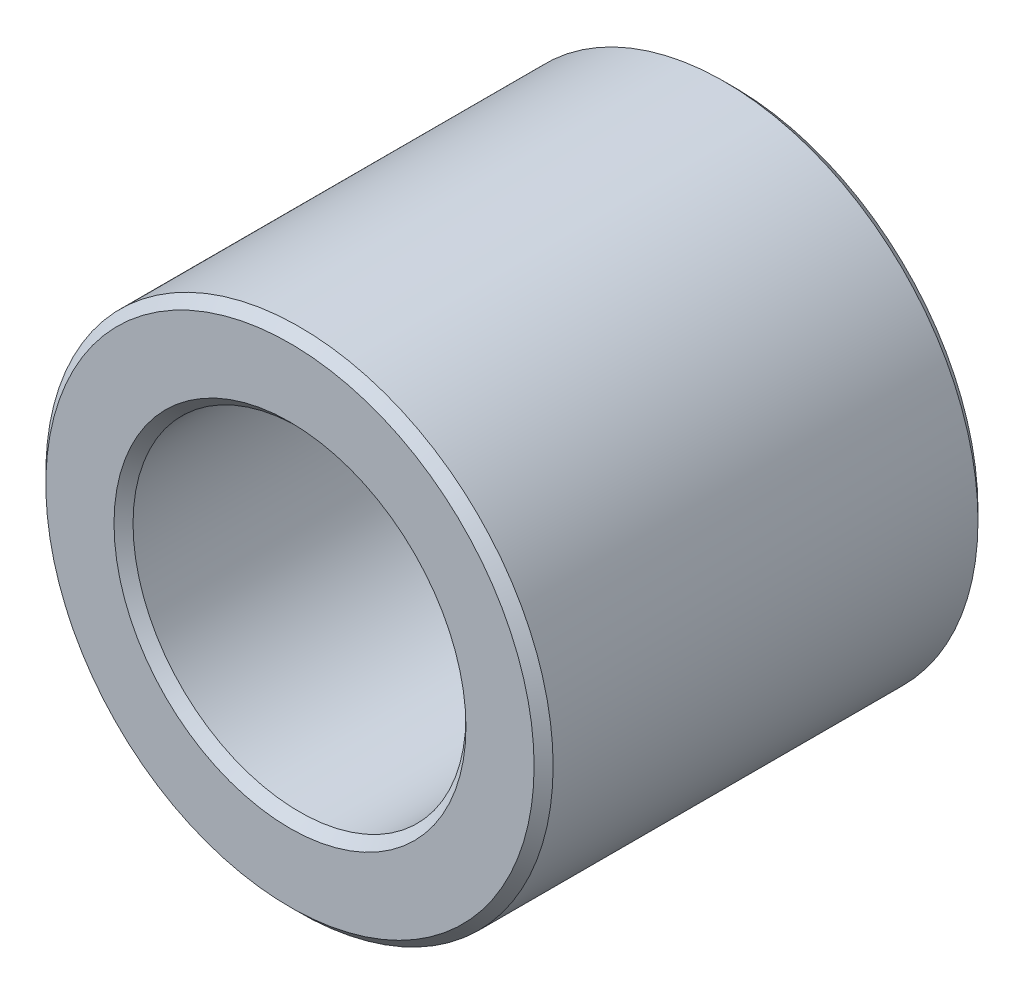
ISO-10303-21;
HEADER;
FILE_DESCRIPTION(('STEP AP214'),'2;1');
FILE_NAME('part.step','',(''),(''),'','','');
FILE_SCHEMA(('AUTOMOTIVE_DESIGN { 1 0 10303 214 1 1 1 1 }'));
ENDSEC;
DATA;
#1=APPLICATION_CONTEXT('core data for automotive mechanical design processes');
#2=APPLICATION_PROTOCOL_DEFINITION('international standard','automotive_design',2000,#1);
#3=PRODUCT_CONTEXT('',#1,'mechanical');
#4=PRODUCT('Part','Part','',(#3));
#5=PRODUCT_RELATED_PRODUCT_CATEGORY('part','',(#4));
#6=PRODUCT_DEFINITION_FORMATION('','',#4);
#7=PRODUCT_DEFINITION_CONTEXT('part definition',#1,'design');
#8=PRODUCT_DEFINITION('design','',#6,#7);
#9=PRODUCT_DEFINITION_SHAPE('','',#8);
#10=(LENGTH_UNIT() NAMED_UNIT(*) SI_UNIT(.MILLI.,.METRE.));
#11=(NAMED_UNIT(*) PLANE_ANGLE_UNIT() SI_UNIT($,.RADIAN.));
#12=(NAMED_UNIT(*) SI_UNIT($,.STERADIAN.) SOLID_ANGLE_UNIT());
#13=UNCERTAINTY_MEASURE_WITH_UNIT(LENGTH_MEASURE(1.E-05),#10,'distance_accuracy_value','');
#14=(GEOMETRIC_REPRESENTATION_CONTEXT(3) GLOBAL_UNCERTAINTY_ASSIGNED_CONTEXT((#13)) GLOBAL_UNIT_ASSIGNED_CONTEXT((#10,
#11,#12)) REPRESENTATION_CONTEXT('',''));
#15=CARTESIAN_POINT('',(0.,0.,0.));
#16=DIRECTION('',(0.,0.,1.));
#17=DIRECTION('',(1.,0.,0.));
#18=AXIS2_PLACEMENT_3D('',#15,#16,#17);
#19=CARTESIAN_POINT('',(0.,0.,14.));
#20=DIRECTION('',(0.,0.,-1.));
#21=DIRECTION('',(-1.,0.,0.));
#22=AXIS2_PLACEMENT_3D('',#19,#20,#21);
#23=CYLINDRICAL_SURFACE('',#22,8.);
#24=CARTESIAN_POINT('',(0.,0.,0.3));
#25=DIRECTION('',(0.,0.,1.));
#26=DIRECTION('',(1.,0.,0.));
#27=AXIS2_PLACEMENT_3D('',#24,#25,#26);
#28=CIRCLE('',#27,8.);
#29=CARTESIAN_POINT('',(8.,0.,0.3));
#30=VERTEX_POINT('',#29);
#31=EDGE_CURVE('E53',#30,#30,#28,.T.);
#32=ORIENTED_EDGE('',*,*,#31,.T.);
#33=EDGE_LOOP('',(#32));
#34=FACE_BOUND('',#33,.T.);
#35=CARTESIAN_POINT('',(0.,0.,13.7));
#36=DIRECTION('',(0.,0.,1.));
#37=DIRECTION('',(1.,0.,0.));
#38=AXIS2_PLACEMENT_3D('',#35,#36,#37);
#39=CIRCLE('',#38,8.);
#40=CARTESIAN_POINT('',(8.,0.,13.7));
#41=VERTEX_POINT('',#40);
#42=EDGE_CURVE('E58',#41,#41,#39,.F.);
#43=ORIENTED_EDGE('',*,*,#42,.T.);
#44=EDGE_LOOP('',(#43));
#45=FACE_BOUND('',#44,.T.);
#46=ADVANCED_FACE('F39',(#34,#45),#23,.T.);
#47=CARTESIAN_POINT('',(0.,0.,14.));
#48=DIRECTION('',(0.,0.,1.));
#49=DIRECTION('',(1.,0.,0.));
#50=AXIS2_PLACEMENT_3D('',#47,#48,#49);
#51=PLANE('',#50);
#52=CARTESIAN_POINT('',(0.,0.,14.));
#53=DIRECTION('',(0.,0.,1.));
#54=DIRECTION('',(1.,0.,0.));
#55=AXIS2_PLACEMENT_3D('',#52,#53,#54);
#56=CIRCLE('',#55,7.70000000000001);
#57=CARTESIAN_POINT('',(7.70000000000001,0.,14.));
#58=VERTEX_POINT('',#57);
#59=EDGE_CURVE('E10',#58,#58,#56,.T.);
#60=ORIENTED_EDGE('',*,*,#59,.T.);
#61=EDGE_LOOP('',(#60));
#62=FACE_BOUND('',#61,.T.);
#63=CARTESIAN_POINT('',(0.,0.,14.));
#64=DIRECTION('',(0.,0.,1.));
#65=DIRECTION('',(1.,0.,0.));
#66=AXIS2_PLACEMENT_3D('',#63,#64,#65);
#67=CIRCLE('',#66,5.55);
#68=CARTESIAN_POINT('',(5.55,0.,14.));
#69=VERTEX_POINT('',#68);
#70=EDGE_CURVE('E48',#69,#69,#67,.F.);
#71=ORIENTED_EDGE('',*,*,#70,.T.);
#72=EDGE_LOOP('',(#71));
#73=FACE_BOUND('',#72,.T.);
#74=ADVANCED_FACE('F93',(#62,#73),#51,.T.);
#75=CARTESIAN_POINT('',(0.,0.,0.));
#76=DIRECTION('',(0.,0.,1.));
#77=DIRECTION('',(1.,0.,0.));
#78=AXIS2_PLACEMENT_3D('',#75,#76,#77);
#79=PLANE('',#78);
#80=CARTESIAN_POINT('',(0.,0.,0.));
#81=DIRECTION('',(0.,0.,1.));
#82=DIRECTION('',(1.,0.,0.));
#83=AXIS2_PLACEMENT_3D('',#80,#81,#82);
#84=CIRCLE('',#83,5.55);
#85=CARTESIAN_POINT('',(5.55,0.,0.));
#86=VERTEX_POINT('',#85);
#87=EDGE_CURVE('E72',#86,#86,#84,.T.);
#88=ORIENTED_EDGE('',*,*,#87,.T.);
#89=EDGE_LOOP('',(#88));
#90=FACE_BOUND('',#89,.T.);
#91=CARTESIAN_POINT('',(0.,0.,0.));
#92=DIRECTION('',(0.,0.,1.));
#93=DIRECTION('',(1.,0.,0.));
#94=AXIS2_PLACEMENT_3D('',#91,#92,#93);
#95=CIRCLE('',#94,7.7);
#96=CARTESIAN_POINT('',(7.7,0.,0.));
#97=VERTEX_POINT('',#96);
#98=EDGE_CURVE('E76',#97,#97,#95,.F.);
#99=ORIENTED_EDGE('',*,*,#98,.T.);
#100=EDGE_LOOP('',(#99));
#101=FACE_BOUND('',#100,.T.);
#102=ADVANCED_FACE('F81',(#90,#101),#79,.F.);
#103=CARTESIAN_POINT('',(0.,0.,14.));
#104=DIRECTION('',(0.,0.,-1.));
#105=DIRECTION('',(-1.,0.,0.));
#106=AXIS2_PLACEMENT_3D('',#103,#104,#105);
#107=CYLINDRICAL_SURFACE('',#106,5.25);
#108=CARTESIAN_POINT('',(0.,0.,0.300000000000003));
#109=DIRECTION('',(0.,0.,1.));
#110=DIRECTION('',(1.,0.,0.));
#111=AXIS2_PLACEMENT_3D('',#108,#109,#110);
#112=CIRCLE('',#111,5.25);
#113=CARTESIAN_POINT('',(5.25,0.,0.300000000000003));
#114=VERTEX_POINT('',#113);
#115=EDGE_CURVE('E64',#114,#114,#112,.F.);
#116=ORIENTED_EDGE('',*,*,#115,.T.);
#117=EDGE_LOOP('',(#116));
#118=FACE_BOUND('',#117,.T.);
#119=CARTESIAN_POINT('',(0.,0.,13.7));
#120=DIRECTION('',(0.,0.,1.));
#121=DIRECTION('',(1.,0.,0.));
#122=AXIS2_PLACEMENT_3D('',#119,#120,#121);
#123=CIRCLE('',#122,5.25);
#124=CARTESIAN_POINT('',(5.25,0.,13.7));
#125=VERTEX_POINT('',#124);
#126=EDGE_CURVE('E68',#125,#125,#123,.T.);
#127=ORIENTED_EDGE('',*,*,#126,.T.);
#128=EDGE_LOOP('',(#127));
#129=FACE_BOUND('',#128,.T.);
#130=ADVANCED_FACE('F114',(#118,#129),#107,.F.);
#131=CARTESIAN_POINT('',(0.,0.,0.));
#132=DIRECTION('',(0.,0.,-1.));
#133=DIRECTION('',(-1.,0.,0.));
#134=AXIS2_PLACEMENT_3D('',#131,#132,#133);
#135=CONICAL_SURFACE('',#134,5.55,0.785398163397447);
#136=ORIENTED_EDGE('',*,*,#115,.F.);
#137=EDGE_LOOP('',(#136));
#138=FACE_BOUND('',#137,.T.);
#139=ORIENTED_EDGE('',*,*,#87,.F.);
#140=EDGE_LOOP('',(#139));
#141=FACE_BOUND('',#140,.T.);
#142=ADVANCED_FACE('F87',(#138,#141),#135,.F.);
#143=CARTESIAN_POINT('',(0.,0.,0.3));
#144=DIRECTION('',(0.,0.,1.));
#145=DIRECTION('',(1.,0.,0.));
#146=AXIS2_PLACEMENT_3D('',#143,#144,#145);
#147=CONICAL_SURFACE('',#146,8.,0.785398163397454);
#148=ORIENTED_EDGE('',*,*,#98,.F.);
#149=EDGE_LOOP('',(#148));
#150=FACE_BOUND('',#149,.T.);
#151=ORIENTED_EDGE('',*,*,#31,.F.);
#152=EDGE_LOOP('',(#151));
#153=FACE_BOUND('',#152,.T.);
#154=ADVANCED_FACE('F83',(#150,#153),#147,.T.);
#155=CARTESIAN_POINT('',(0.,0.,14.));
#156=DIRECTION('',(0.,0.,-1.));
#157=DIRECTION('',(-1.,0.,0.));
#158=AXIS2_PLACEMENT_3D('',#155,#156,#157);
#159=CONICAL_SURFACE('',#158,7.70000000000001,0.785398163397445);
#160=ORIENTED_EDGE('',*,*,#42,.F.);
#161=EDGE_LOOP('',(#160));
#162=FACE_BOUND('',#161,.T.);
#163=ORIENTED_EDGE('',*,*,#59,.F.);
#164=EDGE_LOOP('',(#163));
#165=FACE_BOUND('',#164,.T.);
#166=ADVANCED_FACE('F86',(#162,#165),#159,.T.);
#167=CARTESIAN_POINT('',(0.,0.,13.7));
#168=DIRECTION('',(0.,0.,1.));
#169=DIRECTION('',(1.,0.,0.));
#170=AXIS2_PLACEMENT_3D('',#167,#168,#169);
#171=CONICAL_SURFACE('',#170,5.25,0.785398163397455);
#172=ORIENTED_EDGE('',*,*,#70,.F.);
#173=EDGE_LOOP('',(#172));
#174=FACE_BOUND('',#173,.T.);
#175=ORIENTED_EDGE('',*,*,#126,.F.);
#176=EDGE_LOOP('',(#175));
#177=FACE_BOUND('',#176,.T.);
#178=ADVANCED_FACE('F42',(#174,#177),#171,.F.);
#179=CLOSED_SHELL('',(#46,#74,#102,#130,#142,#154,#166,#178));
#180=MANIFOLD_SOLID_BREP('B2',#179);
#181=ADVANCED_BREP_SHAPE_REPRESENTATION('',(#18,#180),#14);
#182=SHAPE_DEFINITION_REPRESENTATION(#9,#181);
ENDSEC;
END-ISO-10303-21;
